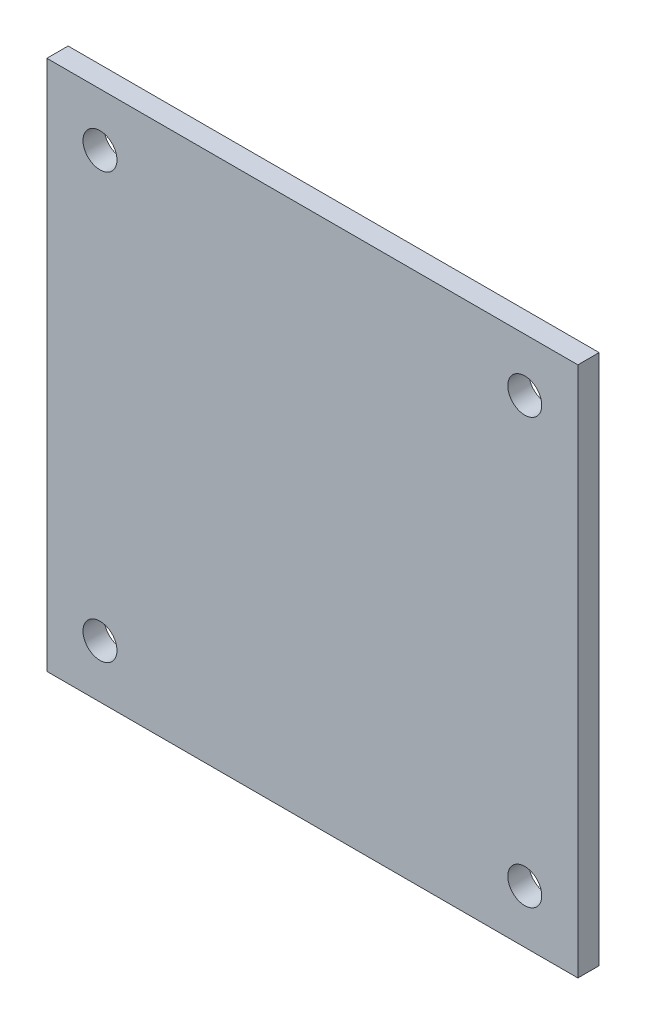
ISO-10303-21;
HEADER;
FILE_DESCRIPTION(('STEP AP214'),'2;1');
FILE_NAME('part.step','',(''),(''),'','','');
FILE_SCHEMA(('AUTOMOTIVE_DESIGN { 1 0 10303 214 1 1 1 1 }'));
ENDSEC;
DATA;
#1=APPLICATION_CONTEXT('core data for automotive mechanical design processes');
#2=APPLICATION_PROTOCOL_DEFINITION('international standard','automotive_design',2000,#1);
#3=PRODUCT_CONTEXT('',#1,'mechanical');
#4=PRODUCT('Part','Part','',(#3));
#5=PRODUCT_RELATED_PRODUCT_CATEGORY('part','',(#4));
#6=PRODUCT_DEFINITION_FORMATION('','',#4);
#7=PRODUCT_DEFINITION_CONTEXT('part definition',#1,'design');
#8=PRODUCT_DEFINITION('design','',#6,#7);
#9=PRODUCT_DEFINITION_SHAPE('','',#8);
#10=(LENGTH_UNIT() NAMED_UNIT(*) SI_UNIT(.MILLI.,.METRE.));
#11=(NAMED_UNIT(*) PLANE_ANGLE_UNIT() SI_UNIT($,.RADIAN.));
#12=(NAMED_UNIT(*) SI_UNIT($,.STERADIAN.) SOLID_ANGLE_UNIT());
#13=UNCERTAINTY_MEASURE_WITH_UNIT(LENGTH_MEASURE(1.E-05),#10,'distance_accuracy_value','');
#14=(GEOMETRIC_REPRESENTATION_CONTEXT(3) GLOBAL_UNCERTAINTY_ASSIGNED_CONTEXT((#13)) GLOBAL_UNIT_ASSIGNED_CONTEXT((#10,
#11,#12)) REPRESENTATION_CONTEXT('',''));
#15=CARTESIAN_POINT('',(0.,0.,0.));
#16=DIRECTION('',(0.,0.,1.));
#17=DIRECTION('',(1.,0.,0.));
#18=AXIS2_PLACEMENT_3D('',#15,#16,#17);
#19=CARTESIAN_POINT('',(100.,100.,10.));
#20=DIRECTION('',(0.,0.,-1.));
#21=DIRECTION('',(-1.,0.,0.));
#22=AXIS2_PLACEMENT_3D('',#19,#20,#21);
#23=CYLINDRICAL_SURFACE('',#22,8.);
#24=DIRECTION('',(0.,0.,-1.));
#25=VECTOR('',#24,1.);
#26=CARTESIAN_POINT('',(92.,100.,10.));
#27=LINE('',#26,#25);
#28=CARTESIAN_POINT('',(92.,100.,10.));
#29=VERTEX_POINT('',#28);
#30=CARTESIAN_POINT('',(92.,100.,0.));
#31=VERTEX_POINT('',#30);
#32=EDGE_CURVE('E11',#29,#31,#27,.T.);
#33=ORIENTED_EDGE('',*,*,#32,.F.);
#34=CARTESIAN_POINT('',(100.,100.,10.));
#35=DIRECTION('',(0.,0.,-1.));
#36=DIRECTION('',(-1.,0.,0.));
#37=AXIS2_PLACEMENT_3D('',#34,#35,#36);
#38=CIRCLE('',#37,8.);
#39=EDGE_CURVE('E75',#29,#29,#38,.T.);
#40=ORIENTED_EDGE('',*,*,#39,.F.);
#41=ORIENTED_EDGE('',*,*,#32,.T.);
#42=CARTESIAN_POINT('',(100.,100.,0.));
#43=DIRECTION('',(0.,0.,-1.));
#44=DIRECTION('',(-1.,0.,0.));
#45=AXIS2_PLACEMENT_3D('',#42,#43,#44);
#46=CIRCLE('',#45,8.);
#47=EDGE_CURVE('E182',#31,#31,#46,.T.);
#48=ORIENTED_EDGE('',*,*,#47,.T.);
#49=EDGE_LOOP('',(#33,#40,#41,#48));
#50=FACE_BOUND('',#49,.T.);
#51=ADVANCED_FACE('F17',(#50),#23,.F.);
#52=CARTESIAN_POINT('',(-100.,100.,10.));
#53=DIRECTION('',(0.,0.,-1.));
#54=DIRECTION('',(-1.,0.,0.));
#55=AXIS2_PLACEMENT_3D('',#52,#53,#54);
#56=CYLINDRICAL_SURFACE('',#55,8.);
#57=DIRECTION('',(0.,0.,-1.));
#58=VECTOR('',#57,1.);
#59=CARTESIAN_POINT('',(-108.,100.,10.));
#60=LINE('',#59,#58);
#61=CARTESIAN_POINT('',(-108.,100.,10.));
#62=VERTEX_POINT('',#61);
#63=CARTESIAN_POINT('',(-108.,100.,0.));
#64=VERTEX_POINT('',#63);
#65=EDGE_CURVE('E26',#62,#64,#60,.T.);
#66=ORIENTED_EDGE('',*,*,#65,.F.);
#67=CARTESIAN_POINT('',(-100.,100.,10.));
#68=DIRECTION('',(0.,0.,-1.));
#69=DIRECTION('',(-1.,0.,0.));
#70=AXIS2_PLACEMENT_3D('',#67,#68,#69);
#71=CIRCLE('',#70,8.);
#72=EDGE_CURVE('E68',#62,#62,#71,.T.);
#73=ORIENTED_EDGE('',*,*,#72,.F.);
#74=ORIENTED_EDGE('',*,*,#65,.T.);
#75=CARTESIAN_POINT('',(-100.,100.,0.));
#76=DIRECTION('',(0.,0.,-1.));
#77=DIRECTION('',(-1.,0.,0.));
#78=AXIS2_PLACEMENT_3D('',#75,#76,#77);
#79=CIRCLE('',#78,8.);
#80=EDGE_CURVE('E92',#64,#64,#79,.T.);
#81=ORIENTED_EDGE('',*,*,#80,.T.);
#82=EDGE_LOOP('',(#66,#73,#74,#81));
#83=FACE_BOUND('',#82,.T.);
#84=ADVANCED_FACE('F90',(#83),#56,.F.);
#85=CARTESIAN_POINT('',(100.,-100.,10.));
#86=DIRECTION('',(0.,0.,-1.));
#87=DIRECTION('',(-1.,0.,0.));
#88=AXIS2_PLACEMENT_3D('',#85,#86,#87);
#89=CYLINDRICAL_SURFACE('',#88,8.);
#90=DIRECTION('',(0.,0.,-1.));
#91=VECTOR('',#90,1.);
#92=CARTESIAN_POINT('',(92.,-100.,10.));
#93=LINE('',#92,#91);
#94=CARTESIAN_POINT('',(92.,-100.,10.));
#95=VERTEX_POINT('',#94);
#96=CARTESIAN_POINT('',(92.,-100.,0.));
#97=VERTEX_POINT('',#96);
#98=EDGE_CURVE('E55',#95,#97,#93,.T.);
#99=ORIENTED_EDGE('',*,*,#98,.F.);
#100=CARTESIAN_POINT('',(100.,-100.,10.));
#101=DIRECTION('',(0.,0.,-1.));
#102=DIRECTION('',(-1.,0.,0.));
#103=AXIS2_PLACEMENT_3D('',#100,#101,#102);
#104=CIRCLE('',#103,8.);
#105=EDGE_CURVE('E58',#95,#95,#104,.T.);
#106=ORIENTED_EDGE('',*,*,#105,.F.);
#107=ORIENTED_EDGE('',*,*,#98,.T.);
#108=CARTESIAN_POINT('',(100.,-100.,0.));
#109=DIRECTION('',(0.,0.,-1.));
#110=DIRECTION('',(-1.,0.,0.));
#111=AXIS2_PLACEMENT_3D('',#108,#109,#110);
#112=CIRCLE('',#111,8.);
#113=EDGE_CURVE('E60',#97,#97,#112,.T.);
#114=ORIENTED_EDGE('',*,*,#113,.T.);
#115=EDGE_LOOP('',(#99,#106,#107,#114));
#116=FACE_BOUND('',#115,.T.);
#117=ADVANCED_FACE('F57',(#116),#89,.F.);
#118=CARTESIAN_POINT('',(-100.,-100.,10.));
#119=DIRECTION('',(0.,0.,-1.));
#120=DIRECTION('',(-1.,0.,0.));
#121=AXIS2_PLACEMENT_3D('',#118,#119,#120);
#122=CYLINDRICAL_SURFACE('',#121,8.);
#123=DIRECTION('',(0.,0.,-1.));
#124=VECTOR('',#123,1.);
#125=CARTESIAN_POINT('',(-108.,-100.,10.));
#126=LINE('',#125,#124);
#127=CARTESIAN_POINT('',(-108.,-100.,10.));
#128=VERTEX_POINT('',#127);
#129=CARTESIAN_POINT('',(-108.,-100.,0.));
#130=VERTEX_POINT('',#129);
#131=EDGE_CURVE('E62',#128,#130,#126,.T.);
#132=ORIENTED_EDGE('',*,*,#131,.F.);
#133=CARTESIAN_POINT('',(-100.,-100.,10.));
#134=DIRECTION('',(0.,0.,-1.));
#135=DIRECTION('',(-1.,0.,0.));
#136=AXIS2_PLACEMENT_3D('',#133,#134,#135);
#137=CIRCLE('',#136,8.);
#138=EDGE_CURVE('E69',#128,#128,#137,.T.);
#139=ORIENTED_EDGE('',*,*,#138,.F.);
#140=ORIENTED_EDGE('',*,*,#131,.T.);
#141=CARTESIAN_POINT('',(-100.,-100.,0.));
#142=DIRECTION('',(0.,0.,-1.));
#143=DIRECTION('',(-1.,0.,0.));
#144=AXIS2_PLACEMENT_3D('',#141,#142,#143);
#145=CIRCLE('',#144,8.);
#146=EDGE_CURVE('E174',#130,#130,#145,.T.);
#147=ORIENTED_EDGE('',*,*,#146,.T.);
#148=EDGE_LOOP('',(#132,#139,#140,#147));
#149=FACE_BOUND('',#148,.T.);
#150=ADVANCED_FACE('F110',(#149),#122,.F.);
#151=CARTESIAN_POINT('',(125.,125.,0.));
#152=DIRECTION('',(0.,-1.,0.));
#153=DIRECTION('',(0.,0.,-1.));
#154=AXIS2_PLACEMENT_3D('',#151,#152,#153);
#155=PLANE('',#154);
#156=DIRECTION('',(-1.,0.,0.));
#157=VECTOR('',#156,1.);
#158=CARTESIAN_POINT('',(125.,125.,0.));
#159=LINE('',#158,#157);
#160=CARTESIAN_POINT('',(125.,125.,0.));
#161=VERTEX_POINT('',#160);
#162=CARTESIAN_POINT('',(-125.,125.,0.));
#163=VERTEX_POINT('',#162);
#164=EDGE_CURVE('E170',#161,#163,#159,.T.);
#165=ORIENTED_EDGE('',*,*,#164,.T.);
#166=DIRECTION('',(0.,0.,1.));
#167=VECTOR('',#166,1.);
#168=CARTESIAN_POINT('',(-125.,125.,0.));
#169=LINE('',#168,#167);
#170=CARTESIAN_POINT('',(-125.,125.,10.));
#171=VERTEX_POINT('',#170);
#172=EDGE_CURVE('E159',#163,#171,#169,.T.);
#173=ORIENTED_EDGE('',*,*,#172,.T.);
#174=DIRECTION('',(-1.,0.,0.));
#175=VECTOR('',#174,1.);
#176=CARTESIAN_POINT('',(125.,125.,10.));
#177=LINE('',#176,#175);
#178=CARTESIAN_POINT('',(125.,125.,10.));
#179=VERTEX_POINT('',#178);
#180=EDGE_CURVE('E78',#179,#171,#177,.T.);
#181=ORIENTED_EDGE('',*,*,#180,.F.);
#182=DIRECTION('',(0.,0.,1.));
#183=VECTOR('',#182,1.);
#184=CARTESIAN_POINT('',(125.,125.,0.));
#185=LINE('',#184,#183);
#186=EDGE_CURVE('E147',#161,#179,#185,.T.);
#187=ORIENTED_EDGE('',*,*,#186,.F.);
#188=EDGE_LOOP('',(#165,#173,#181,#187));
#189=FACE_BOUND('',#188,.T.);
#190=ADVANCED_FACE('F98',(#189),#155,.F.);
#191=CARTESIAN_POINT('',(0.,0.,10.));
#192=DIRECTION('',(0.,0.,1.));
#193=DIRECTION('',(1.,0.,0.));
#194=AXIS2_PLACEMENT_3D('',#191,#192,#193);
#195=PLANE('',#194);
#196=ORIENTED_EDGE('',*,*,#39,.T.);
#197=EDGE_LOOP('',(#196));
#198=FACE_BOUND('',#197,.T.);
#199=ORIENTED_EDGE('',*,*,#72,.T.);
#200=EDGE_LOOP('',(#199));
#201=FACE_BOUND('',#200,.T.);
#202=ORIENTED_EDGE('',*,*,#105,.T.);
#203=EDGE_LOOP('',(#202));
#204=FACE_BOUND('',#203,.T.);
#205=ORIENTED_EDGE('',*,*,#138,.T.);
#206=EDGE_LOOP('',(#205));
#207=FACE_BOUND('',#206,.T.);
#208=DIRECTION('',(1.,0.,0.));
#209=VECTOR('',#208,1.);
#210=CARTESIAN_POINT('',(-125.,-125.,10.));
#211=LINE('',#210,#209);
#212=CARTESIAN_POINT('',(-125.,-125.,10.));
#213=VERTEX_POINT('',#212);
#214=CARTESIAN_POINT('',(125.,-125.,10.));
#215=VERTEX_POINT('',#214);
#216=EDGE_CURVE('E194',#213,#215,#211,.T.);
#217=ORIENTED_EDGE('',*,*,#216,.T.);
#218=DIRECTION('',(0.,1.,0.));
#219=VECTOR('',#218,1.);
#220=CARTESIAN_POINT('',(125.,-125.,10.));
#221=LINE('',#220,#219);
#222=EDGE_CURVE('E163',#215,#179,#221,.T.);
#223=ORIENTED_EDGE('',*,*,#222,.T.);
#224=ORIENTED_EDGE('',*,*,#180,.T.);
#225=DIRECTION('',(0.,-1.,0.));
#226=VECTOR('',#225,1.);
#227=CARTESIAN_POINT('',(-125.,125.,10.));
#228=LINE('',#227,#226);
#229=EDGE_CURVE('E167',#171,#213,#228,.T.);
#230=ORIENTED_EDGE('',*,*,#229,.T.);
#231=EDGE_LOOP('',(#217,#223,#224,#230));
#232=FACE_BOUND('',#231,.T.);
#233=ADVANCED_FACE('F65',(#198,#201,#204,#207,#232),#195,.T.);
#234=CARTESIAN_POINT('',(0.,0.,0.));
#235=DIRECTION('',(0.,0.,1.));
#236=DIRECTION('',(1.,0.,0.));
#237=AXIS2_PLACEMENT_3D('',#234,#235,#236);
#238=PLANE('',#237);
#239=ORIENTED_EDGE('',*,*,#47,.F.);
#240=EDGE_LOOP('',(#239));
#241=FACE_BOUND('',#240,.T.);
#242=ORIENTED_EDGE('',*,*,#80,.F.);
#243=EDGE_LOOP('',(#242));
#244=FACE_BOUND('',#243,.T.);
#245=ORIENTED_EDGE('',*,*,#113,.F.);
#246=EDGE_LOOP('',(#245));
#247=FACE_BOUND('',#246,.T.);
#248=ORIENTED_EDGE('',*,*,#146,.F.);
#249=EDGE_LOOP('',(#248));
#250=FACE_BOUND('',#249,.T.);
#251=DIRECTION('',(0.,-1.,0.));
#252=VECTOR('',#251,1.);
#253=CARTESIAN_POINT('',(-125.,125.,0.));
#254=LINE('',#253,#252);
#255=CARTESIAN_POINT('',(-125.,-125.,0.));
#256=VERTEX_POINT('',#255);
#257=EDGE_CURVE('E201',#163,#256,#254,.T.);
#258=ORIENTED_EDGE('',*,*,#257,.F.);
#259=ORIENTED_EDGE('',*,*,#164,.F.);
#260=DIRECTION('',(0.,1.,0.));
#261=VECTOR('',#260,1.);
#262=CARTESIAN_POINT('',(125.,-125.,0.));
#263=LINE('',#262,#261);
#264=CARTESIAN_POINT('',(125.,-125.,0.));
#265=VERTEX_POINT('',#264);
#266=EDGE_CURVE('E143',#265,#161,#263,.T.);
#267=ORIENTED_EDGE('',*,*,#266,.F.);
#268=DIRECTION('',(1.,0.,0.));
#269=VECTOR('',#268,1.);
#270=CARTESIAN_POINT('',(-125.,-125.,0.));
#271=LINE('',#270,#269);
#272=EDGE_CURVE('E219',#256,#265,#271,.T.);
#273=ORIENTED_EDGE('',*,*,#272,.F.);
#274=EDGE_LOOP('',(#258,#259,#267,#273));
#275=FACE_BOUND('',#274,.T.);
#276=ADVANCED_FACE('F97',(#241,#244,#247,#250,#275),#238,.F.);
#277=CARTESIAN_POINT('',(125.,-125.,0.));
#278=DIRECTION('',(-1.,0.,0.));
#279=DIRECTION('',(0.,0.,1.));
#280=AXIS2_PLACEMENT_3D('',#277,#278,#279);
#281=PLANE('',#280);
#282=ORIENTED_EDGE('',*,*,#266,.T.);
#283=ORIENTED_EDGE('',*,*,#186,.T.);
#284=ORIENTED_EDGE('',*,*,#222,.F.);
#285=DIRECTION('',(0.,0.,1.));
#286=VECTOR('',#285,1.);
#287=CARTESIAN_POINT('',(125.,-125.,0.));
#288=LINE('',#287,#286);
#289=EDGE_CURVE('E150',#265,#215,#288,.T.);
#290=ORIENTED_EDGE('',*,*,#289,.F.);
#291=EDGE_LOOP('',(#282,#283,#284,#290));
#292=FACE_BOUND('',#291,.T.);
#293=ADVANCED_FACE('F107',(#292),#281,.F.);
#294=CARTESIAN_POINT('',(-125.,125.,0.));
#295=DIRECTION('',(1.,0.,0.));
#296=DIRECTION('',(0.,1.,0.));
#297=AXIS2_PLACEMENT_3D('',#294,#295,#296);
#298=PLANE('',#297);
#299=ORIENTED_EDGE('',*,*,#257,.T.);
#300=DIRECTION('',(0.,0.,1.));
#301=VECTOR('',#300,1.);
#302=CARTESIAN_POINT('',(-125.,-125.,0.));
#303=LINE('',#302,#301);
#304=EDGE_CURVE('E197',#256,#213,#303,.T.);
#305=ORIENTED_EDGE('',*,*,#304,.T.);
#306=ORIENTED_EDGE('',*,*,#229,.F.);
#307=ORIENTED_EDGE('',*,*,#172,.F.);
#308=EDGE_LOOP('',(#299,#305,#306,#307));
#309=FACE_BOUND('',#308,.T.);
#310=ADVANCED_FACE('F128',(#309),#298,.F.);
#311=CARTESIAN_POINT('',(-125.,-125.,0.));
#312=DIRECTION('',(0.,1.,0.));
#313=DIRECTION('',(1.,0.,0.));
#314=AXIS2_PLACEMENT_3D('',#311,#312,#313);
#315=PLANE('',#314);
#316=ORIENTED_EDGE('',*,*,#272,.T.);
#317=ORIENTED_EDGE('',*,*,#289,.T.);
#318=ORIENTED_EDGE('',*,*,#216,.F.);
#319=ORIENTED_EDGE('',*,*,#304,.F.);
#320=EDGE_LOOP('',(#316,#317,#318,#319));
#321=FACE_BOUND('',#320,.T.);
#322=ADVANCED_FACE('F125',(#321),#315,.F.);
#323=CLOSED_SHELL('',(#51,#84,#117,#150,#190,#233,#276,#293,#310,#322));
#324=MANIFOLD_SOLID_BREP('B1',#323);
#325=ADVANCED_BREP_SHAPE_REPRESENTATION('',(#18,#324),#14);
#326=SHAPE_DEFINITION_REPRESENTATION(#9,#325);
ENDSEC;
END-ISO-10303-21;
